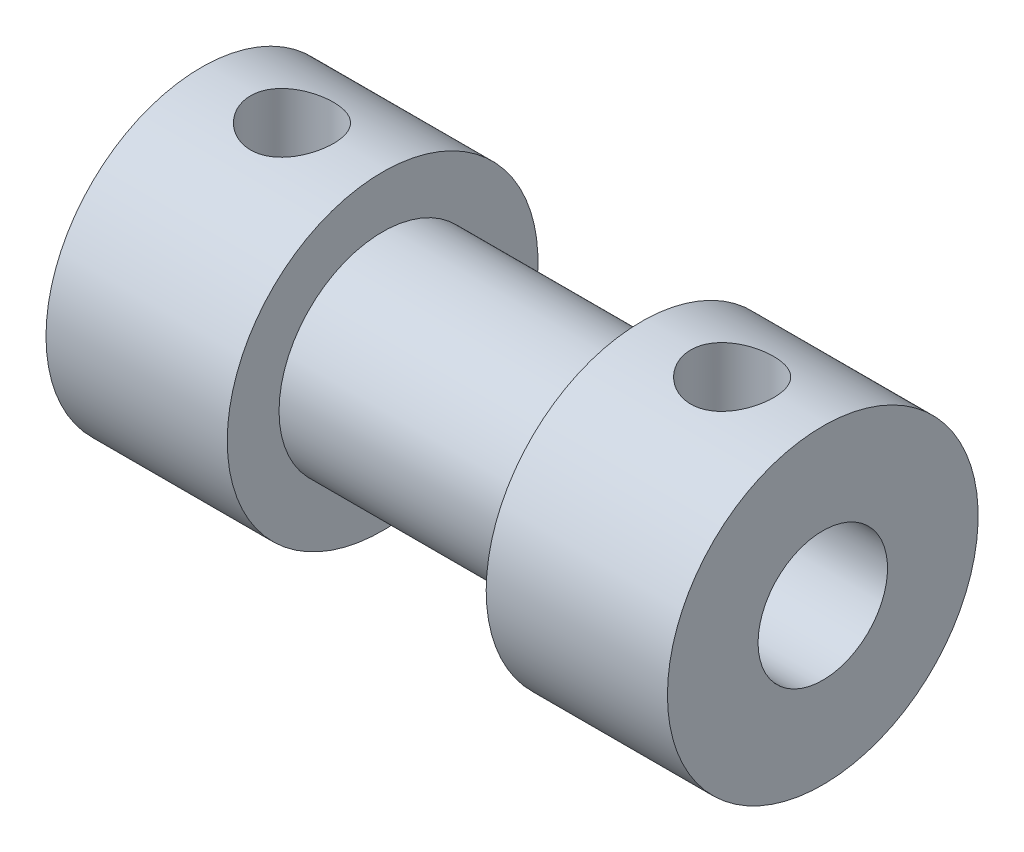
ISO-10303-21;
HEADER;
FILE_DESCRIPTION(('STEP AP214'),'2;1');
FILE_NAME('part.step','',(''),(''),'','','');
FILE_SCHEMA(('AUTOMOTIVE_DESIGN { 1 0 10303 214 1 1 1 1 }'));
ENDSEC;
DATA;
#1=APPLICATION_CONTEXT('core data for automotive mechanical design processes');
#2=APPLICATION_PROTOCOL_DEFINITION('international standard','automotive_design',2000,#1);
#3=PRODUCT_CONTEXT('',#1,'mechanical');
#4=PRODUCT('Part','Part','',(#3));
#5=PRODUCT_RELATED_PRODUCT_CATEGORY('part','',(#4));
#6=PRODUCT_DEFINITION_FORMATION('','',#4);
#7=PRODUCT_DEFINITION_CONTEXT('part definition',#1,'design');
#8=PRODUCT_DEFINITION('design','',#6,#7);
#9=PRODUCT_DEFINITION_SHAPE('','',#8);
#10=(LENGTH_UNIT() NAMED_UNIT(*) SI_UNIT(.MILLI.,.METRE.));
#11=(NAMED_UNIT(*) PLANE_ANGLE_UNIT() SI_UNIT($,.RADIAN.));
#12=(NAMED_UNIT(*) SI_UNIT($,.STERADIAN.) SOLID_ANGLE_UNIT());
#13=UNCERTAINTY_MEASURE_WITH_UNIT(LENGTH_MEASURE(1.E-05),#10,'distance_accuracy_value','');
#14=(GEOMETRIC_REPRESENTATION_CONTEXT(3) GLOBAL_UNCERTAINTY_ASSIGNED_CONTEXT((#13)) GLOBAL_UNIT_ASSIGNED_CONTEXT((#10,
#11,#12)) REPRESENTATION_CONTEXT('',''));
#15=CARTESIAN_POINT('',(0.,0.,0.));
#16=DIRECTION('',(0.,0.,1.));
#17=DIRECTION('',(1.,0.,0.));
#18=AXIS2_PLACEMENT_3D('',#15,#16,#17);
#19=CARTESIAN_POINT('',(0.,0.,0.));
#20=DIRECTION('',(-1.,0.,0.));
#21=DIRECTION('',(0.,0.,1.));
#22=AXIS2_PLACEMENT_3D('',#19,#20,#21);
#23=CYLINDRICAL_SURFACE('',#22,6.00000000000001);
#24=CARTESIAN_POINT('',(0.,0.,0.));
#25=DIRECTION('',(-1.,0.,0.));
#26=DIRECTION('',(0.,0.,1.));
#27=AXIS2_PLACEMENT_3D('',#24,#25,#26);
#28=CIRCLE('',#27,6.00000000000001);
#29=CARTESIAN_POINT('',(0.,0.,6.00000000000001));
#30=VERTEX_POINT('',#29);
#31=EDGE_CURVE('E117',#30,#30,#28,.T.);
#32=ORIENTED_EDGE('',*,*,#31,.F.);
#33=EDGE_LOOP('',(#32));
#34=FACE_BOUND('',#33,.T.);
#35=CARTESIAN_POINT('',(7.,0.,0.));
#36=DIRECTION('',(-1.,0.,0.));
#37=DIRECTION('',(0.,0.,1.));
#38=AXIS2_PLACEMENT_3D('',#35,#36,#37);
#39=CIRCLE('',#38,6.00000000000001);
#40=CARTESIAN_POINT('',(7.,0.,6.00000000000001));
#41=VERTEX_POINT('',#40);
#42=EDGE_CURVE('E10',#41,#41,#39,.T.);
#43=ORIENTED_EDGE('',*,*,#42,.T.);
#44=EDGE_LOOP('',(#43));
#45=FACE_BOUND('',#44,.T.);
#46=CARTESIAN_POINT('',(3.5,5.78273291792039,-1.6));
#47=CARTESIAN_POINT('',(3.58814075019101,5.78273444556331,-1.59999787452613));
#48=CARTESIAN_POINT('',(3.67630400038049,5.78477011639345,-1.59269194579772));
#49=CARTESIAN_POINT('',(3.85008433724543,5.79266848924473,-1.56371666608212));
#50=CARTESIAN_POINT('',(3.93570012398253,5.79853311126454,-1.54204010896768));
#51=CARTESIAN_POINT('',(4.10184645595733,5.81337900141366,-1.48508676448053));
#52=CARTESIAN_POINT('',(4.18238396706272,5.82235588547336,-1.44982910033741));
#53=CARTESIAN_POINT('',(4.33641339204788,5.8424092393635,-1.36677427650965));
#54=CARTESIAN_POINT('',(4.4099047580056,5.85348587227547,-1.3189761427316));
#55=CARTESIAN_POINT('',(4.54959403759017,5.87680111642766,-1.21091878299647));
#56=CARTESIAN_POINT('',(4.61558961397157,5.88906032893153,-1.15040238003367));
#57=CARTESIAN_POINT('',(4.73662526156096,5.91318161149208,-1.01917941827217));
#58=CARTESIAN_POINT('',(4.79166419691344,5.92504364026753,-0.948471804277317));
#59=CARTESIAN_POINT('',(4.89006795072234,5.94726390774735,-0.797470536698617));
#60=CARTESIAN_POINT('',(4.93323161490629,5.95759501009835,-0.717041455903585));
#61=CARTESIAN_POINT('',(5.00534770829381,5.97535300969468,-0.549746435783273));
#62=CARTESIAN_POINT('',(5.03430253382525,5.9827803966101,-0.462881584700083));
#63=CARTESIAN_POINT('',(5.07652417618862,5.9937484286117,-0.287292769448072));
#64=CARTESIAN_POINT('',(5.09013518130073,5.99737421400213,-0.198656979360733));
#65=CARTESIAN_POINT('',(5.10236569608574,6.000628196942,-0.0202908428068604));
#66=CARTESIAN_POINT('',(5.10098771490411,6.00025706357287,0.0694393179508239));
#67=CARTESIAN_POINT('',(5.08352174996842,5.99562140687814,0.245051389689077));
#68=CARTESIAN_POINT('',(5.06780563389097,5.99145531221602,0.330973280576889));
#69=CARTESIAN_POINT('',(5.02271028977444,5.97981398872374,0.498913052456844));
#70=CARTESIAN_POINT('',(4.99333028265117,5.97233857120463,0.580930710544465));
#71=CARTESIAN_POINT('',(4.9214561219261,5.95477255279923,0.739683156118044));
#72=CARTESIAN_POINT('',(4.87883455431944,5.94465670302172,0.816357349063633));
#73=CARTESIAN_POINT('',(4.78178494439273,5.9228997480757,0.961591999011613));
#74=CARTESIAN_POINT('',(4.72735460077747,5.91125834578276,1.03015087046869));
#75=CARTESIAN_POINT('',(4.60625851365286,5.88729018351105,1.15942829557249));
#76=CARTESIAN_POINT('',(4.53926844396049,5.87495335495479,1.21984153614219));
#77=CARTESIAN_POINT('',(4.39598025900898,5.8513072401833,1.32865065683815));
#78=CARTESIAN_POINT('',(4.31968157663975,5.83999801664632,1.37704580423844));
#79=CARTESIAN_POINT('',(4.15927991854284,5.81964721826454,1.46067743349022));
#80=CARTESIAN_POINT('',(4.07513171926907,5.81062005680584,1.49583093280429));
#81=CARTESIAN_POINT('',(3.90181880043644,5.79603460063157,1.55139201348531));
#82=CARTESIAN_POINT('',(3.81265533084127,5.79047544571886,1.57180325169042));
#83=CARTESIAN_POINT('',(3.63469823118271,5.78363868515235,1.59677405674218));
#84=CARTESIAN_POINT('',(3.54597316111142,5.78223810662158,1.60178906096974));
#85=CARTESIAN_POINT('',(3.36895218175803,5.78354062803714,1.597079848984));
#86=CARTESIAN_POINT('',(3.28065622780623,5.78624329125357,1.58735720137773));
#87=CARTESIAN_POINT('',(3.10875472472192,5.79532899431387,1.55385017495931));
#88=CARTESIAN_POINT('',(3.02509164964892,5.80164031753083,1.53033958330325));
#89=CARTESIAN_POINT('',(2.86289629491335,5.81716215168586,1.47023189380392));
#90=CARTESIAN_POINT('',(2.78436468685841,5.82637304120573,1.43363308701324));
#91=CARTESIAN_POINT('',(2.63275603405147,5.8469085797663,1.34746324406962));
#92=CARTESIAN_POINT('',(2.55983681928811,5.8582752389782,1.29762476190339));
#93=CARTESIAN_POINT('',(2.42322935863757,5.88174273547406,1.18672182390013));
#94=CARTESIAN_POINT('',(2.35954285203671,5.8938437104832,1.12565525778373));
#95=CARTESIAN_POINT('',(2.24131802140004,5.91783971907434,0.991923026003871));
#96=CARTESIAN_POINT('',(2.18709729841713,5.92971869219045,0.918973132807078));
#97=CARTESIAN_POINT('',(2.09167121007159,5.95157336013738,0.764742748752596));
#98=CARTESIAN_POINT('',(2.05046515193686,5.96154915626334,0.683462701615108));
#99=CARTESIAN_POINT('',(1.98261629411079,5.97840920719401,0.515451307860697));
#100=CARTESIAN_POINT('',(1.95586478444522,5.98531646784309,0.428766282305868));
#101=CARTESIAN_POINT('',(1.91736901754851,5.99536243029799,0.251919507785058));
#102=CARTESIAN_POINT('',(1.90562143458025,5.99850196723977,0.1617585338562));
#103=CARTESIAN_POINT('',(1.89767534100686,6.00061930750161,-0.0165136010769244));
#104=CARTESIAN_POINT('',(1.90101094469509,5.99972181030495,-0.104602809222309));
#105=CARTESIAN_POINT('',(1.92205479486014,5.99414792783061,-0.278918643704556));
#106=CARTESIAN_POINT('',(1.93976250169353,5.98947168443723,-0.365145339850184));
#107=CARTESIAN_POINT('',(1.98878448393498,5.97689048312845,-0.532728098771436));
#108=CARTESIAN_POINT('',(2.02000423477833,5.96900797751776,-0.614113609481484));
#109=CARTESIAN_POINT('',(2.09507968139661,5.95083853212804,-0.770537678776833));
#110=CARTESIAN_POINT('',(2.13893714928884,5.94055125517941,-0.845575345328786));
#111=CARTESIAN_POINT('',(2.23940661771106,5.918330649808,-0.989342614939897));
#112=CARTESIAN_POINT('',(2.29632750456438,5.90636074702983,-1.05785068939028));
#113=CARTESIAN_POINT('',(2.42072219948647,5.8822720005613,-1.18450029724544));
#114=CARTESIAN_POINT('',(2.4881987806351,5.87015311850575,-1.24263909793084));
#115=CARTESIAN_POINT('',(2.63357471667252,5.84683167732793,-1.34816560187261));
#116=CARTESIAN_POINT('',(2.7116706509992,5.83565513061493,-1.39528875413901));
#117=CARTESIAN_POINT('',(2.87496504876251,5.81585115203584,-1.47566951228968));
#118=CARTESIAN_POINT('',(2.96015882285178,5.80722205399804,-1.50893618695116));
#119=CARTESIAN_POINT('',(3.12086506882721,5.79468800506477,-1.55630499401031));
#120=CARTESIAN_POINT('',(3.19568101164166,5.79024112213282,-1.57265214719335));
#121=CARTESIAN_POINT('',(3.34699244639889,5.78426308173731,-1.59449995435361));
#122=CARTESIAN_POINT('',(3.42348774583211,5.78273159182091,-1.60000184505801));
#123=CARTESIAN_POINT('',(3.5,5.78273291792039,-1.6));
#124=B_SPLINE_CURVE_WITH_KNOTS('',3,(#46,#47,#48,#49,#50,#51,#52,#53,#54,#55,#56,#57,#58,#59,
#60,#61,#62,#63,#64,#65,#66,#67,#68,#69,#70,#71,#72,#73,#74,#75,#76,#77,#78,#79,#80,#81,#82,#83,
#84,#85,#86,#87,#88,#89,#90,#91,#92,#93,#94,#95,#96,#97,#98,#99,#100,#101,#102,#103,#104,#105,
#106,#107,#108,#109,#110,#111,#112,#113,#114,#115,#116,#117,#118,#119,#120,#121,#122,#123),
.UNSPECIFIED.,.T.,.F.,(4,2,2,2,2,2,2,2,2,2,2,2,2,2,2,2,2,2,2,2,2,2,2,2,2,2,2,2,2,2,2,2,2,2,2,2,
2,2,4),(0.,0.26414090249282,0.528414358280161,0.792317049276935,1.05624024524884,
1.32612732904169,1.59604237699569,1.87028165896643,2.14447467443397,2.41238643453184,
2.68025334708483,2.94136456640643,3.20249067552557,3.46621159124456,3.72998394715593,
4.00185409840264,4.27374082111664,4.54730412077229,4.82079953934806,5.08612267391536,
5.35141757070659,5.61161480341916,5.87184602287715,6.13779707970074,6.40379817229036,
6.67748725563563,6.95116176802339,7.22274831668977,7.49427465563061,7.75747243929027,
8.02066034086226,8.28203611890789,8.54344856608627,8.81183083189118,9.08028372300695,
9.35464031183429,9.62881705674852,9.8581357413103,10.0874282742632),.UNSPECIFIED.);
#125=CARTESIAN_POINT('',(3.5,5.78273291792039,-1.6));
#126=VERTEX_POINT('',#125);
#127=EDGE_CURVE('E84',#126,#126,#124,.T.);
#128=ORIENTED_EDGE('',*,*,#127,.T.);
#129=EDGE_LOOP('',(#128));
#130=FACE_BOUND('',#129,.T.);
#131=ADVANCED_FACE('F37',(#34,#45,#130),#23,.T.);
#132=CARTESIAN_POINT('',(0.,0.,0.));
#133=DIRECTION('',(-1.,0.,0.));
#134=DIRECTION('',(0.,0.,1.));
#135=AXIS2_PLACEMENT_3D('',#132,#133,#134);
#136=CYLINDRICAL_SURFACE('',#135,6.00000000000001);
#137=CARTESIAN_POINT('',(17.,0.,0.));
#138=DIRECTION('',(-1.,0.,0.));
#139=DIRECTION('',(0.,0.,1.));
#140=AXIS2_PLACEMENT_3D('',#137,#138,#139);
#141=CIRCLE('',#140,6.00000000000001);
#142=CARTESIAN_POINT('',(17.,0.,6.00000000000001));
#143=VERTEX_POINT('',#142);
#144=EDGE_CURVE('E195',#143,#143,#141,.T.);
#145=ORIENTED_EDGE('',*,*,#144,.F.);
#146=EDGE_LOOP('',(#145));
#147=FACE_BOUND('',#146,.T.);
#148=CARTESIAN_POINT('',(24.,0.,0.));
#149=DIRECTION('',(-1.,0.,0.));
#150=DIRECTION('',(0.,0.,1.));
#151=AXIS2_PLACEMENT_3D('',#148,#149,#150);
#152=CIRCLE('',#151,6.00000000000001);
#153=CARTESIAN_POINT('',(24.,0.,6.00000000000001));
#154=VERTEX_POINT('',#153);
#155=EDGE_CURVE('E193',#154,#154,#152,.T.);
#156=ORIENTED_EDGE('',*,*,#155,.T.);
#157=EDGE_LOOP('',(#156));
#158=FACE_BOUND('',#157,.T.);
#159=CARTESIAN_POINT('',(20.5,5.78273291792039,-1.6));
#160=CARTESIAN_POINT('',(20.588140750191,5.78273444556331,-1.59999787452613));
#161=CARTESIAN_POINT('',(20.6763040003805,5.78477011639345,-1.59269194579772));
#162=CARTESIAN_POINT('',(20.8500843372454,5.79266848924473,-1.56371666608212));
#163=CARTESIAN_POINT('',(20.9357001239825,5.79853311126454,-1.54204010896768));
#164=CARTESIAN_POINT('',(21.1018464559573,5.81337900141366,-1.48508676448053));
#165=CARTESIAN_POINT('',(21.1823839670627,5.82235588547336,-1.44982910033741));
#166=CARTESIAN_POINT('',(21.3364133920479,5.8424092393635,-1.36677427650965));
#167=CARTESIAN_POINT('',(21.4099047580056,5.85348587227547,-1.3189761427316));
#168=CARTESIAN_POINT('',(21.5495940375902,5.87680111642766,-1.21091878299647));
#169=CARTESIAN_POINT('',(21.6155896139716,5.88906032893153,-1.15040238003367));
#170=CARTESIAN_POINT('',(21.736625261561,5.91318161149209,-1.01917941827217));
#171=CARTESIAN_POINT('',(21.7916641969134,5.92504364026753,-0.948471804277316));
#172=CARTESIAN_POINT('',(21.8900679507223,5.94726390774735,-0.797470536698616));
#173=CARTESIAN_POINT('',(21.9332316149063,5.95759501009835,-0.717041455903585));
#174=CARTESIAN_POINT('',(22.0053477082938,5.97535300969468,-0.549746435783274));
#175=CARTESIAN_POINT('',(22.0343025338252,5.9827803966101,-0.462881584700084));
#176=CARTESIAN_POINT('',(22.0765241761886,5.9937484286117,-0.287292769448074));
#177=CARTESIAN_POINT('',(22.0901351813007,5.99737421400213,-0.198656979360734));
#178=CARTESIAN_POINT('',(22.1023656960857,6.000628196942,-0.0202908428068615));
#179=CARTESIAN_POINT('',(22.1009877149041,6.00025706357287,0.0694393179508229));
#180=CARTESIAN_POINT('',(22.0835217499684,5.99562140687814,0.245051389689076));
#181=CARTESIAN_POINT('',(22.067805633891,5.99145531221602,0.330973280576887));
#182=CARTESIAN_POINT('',(22.0227102897744,5.97981398872375,0.498913052456843));
#183=CARTESIAN_POINT('',(21.9933302826512,5.97233857120463,0.580930710544463));
#184=CARTESIAN_POINT('',(21.9214561219261,5.95477255279923,0.739683156118043));
#185=CARTESIAN_POINT('',(21.8788345543194,5.94465670302172,0.816357349063632));
#186=CARTESIAN_POINT('',(21.7817849443927,5.9228997480757,0.961591999011612));
#187=CARTESIAN_POINT('',(21.7273546007775,5.91125834578276,1.03015087046869));
#188=CARTESIAN_POINT('',(21.6062585136529,5.88729018351105,1.15942829557249));
#189=CARTESIAN_POINT('',(21.5392684439605,5.87495335495479,1.21984153614219));
#190=CARTESIAN_POINT('',(21.395980259009,5.8513072401833,1.32865065683815));
#191=CARTESIAN_POINT('',(21.3196815766398,5.83999801664632,1.37704580423844));
#192=CARTESIAN_POINT('',(21.1592799185428,5.81964721826454,1.46067743349022));
#193=CARTESIAN_POINT('',(21.0751317192691,5.81062005680584,1.49583093280429));
#194=CARTESIAN_POINT('',(20.9018188004364,5.79603460063157,1.55139201348531));
#195=CARTESIAN_POINT('',(20.8126553308413,5.79047544571886,1.57180325169042));
#196=CARTESIAN_POINT('',(20.6346982311827,5.78363868515235,1.59677405674218));
#197=CARTESIAN_POINT('',(20.5459731611114,5.78223810662158,1.60178906096974));
#198=CARTESIAN_POINT('',(20.368952181758,5.78354062803714,1.597079848984));
#199=CARTESIAN_POINT('',(20.2806562278062,5.78624329125357,1.58735720137773));
#200=CARTESIAN_POINT('',(20.1087547247219,5.79532899431387,1.55385017495931));
#201=CARTESIAN_POINT('',(20.0250916496489,5.80164031753083,1.53033958330325));
#202=CARTESIAN_POINT('',(19.8628962949134,5.81716215168586,1.47023189380392));
#203=CARTESIAN_POINT('',(19.7843646868584,5.82637304120572,1.43363308701324));
#204=CARTESIAN_POINT('',(19.6327560340515,5.8469085797663,1.34746324406962));
#205=CARTESIAN_POINT('',(19.5598368192881,5.8582752389782,1.29762476190339));
#206=CARTESIAN_POINT('',(19.4232293586376,5.88174273547406,1.18672182390013));
#207=CARTESIAN_POINT('',(19.3595428520367,5.8938437104832,1.12565525778374));
#208=CARTESIAN_POINT('',(19.2413180214,5.91783971907434,0.991923026003872));
#209=CARTESIAN_POINT('',(19.1870972984171,5.92971869219045,0.918973132807078));
#210=CARTESIAN_POINT('',(19.0916712100716,5.95157336013738,0.764742748752596));
#211=CARTESIAN_POINT('',(19.0504651519369,5.96154915626333,0.683462701615107));
#212=CARTESIAN_POINT('',(18.9826162941108,5.97840920719401,0.515451307860697));
#213=CARTESIAN_POINT('',(18.9558647844452,5.98531646784309,0.428766282305869));
#214=CARTESIAN_POINT('',(18.9173690175485,5.99536243029799,0.251919507785059));
#215=CARTESIAN_POINT('',(18.9056214345802,5.99850196723977,0.161758533856202));
#216=CARTESIAN_POINT('',(18.8976753410069,6.00061930750161,-0.0165136010769222));
#217=CARTESIAN_POINT('',(18.9010109446951,5.99972181030495,-0.104602809222307));
#218=CARTESIAN_POINT('',(18.9220547948601,5.99414792783061,-0.278918643704554));
#219=CARTESIAN_POINT('',(18.9397625016935,5.98947168443723,-0.365145339850182));
#220=CARTESIAN_POINT('',(18.988784483935,5.97689048312845,-0.532728098771434));
#221=CARTESIAN_POINT('',(19.0200042347783,5.96900797751776,-0.614113609481481));
#222=CARTESIAN_POINT('',(19.0950796813966,5.95083853212804,-0.770537678776831));
#223=CARTESIAN_POINT('',(19.1389371492888,5.94055125517941,-0.845575345328784));
#224=CARTESIAN_POINT('',(19.2394066177111,5.918330649808,-0.989342614939896));
#225=CARTESIAN_POINT('',(19.2963275045644,5.90636074702983,-1.05785068939028));
#226=CARTESIAN_POINT('',(19.4207221994865,5.8822720005613,-1.18450029724544));
#227=CARTESIAN_POINT('',(19.4881987806351,5.87015311850575,-1.24263909793084));
#228=CARTESIAN_POINT('',(19.6335747166725,5.84683167732793,-1.34816560187261));
#229=CARTESIAN_POINT('',(19.7116706509992,5.83565513061492,-1.39528875413901));
#230=CARTESIAN_POINT('',(19.8749650487625,5.81585115203584,-1.47566951228968));
#231=CARTESIAN_POINT('',(19.9601588228518,5.80722205399804,-1.50893618695116));
#232=CARTESIAN_POINT('',(20.1208650688272,5.79468800506477,-1.55630499401031));
#233=CARTESIAN_POINT('',(20.1956810116417,5.79024112213282,-1.57265214719335));
#234=CARTESIAN_POINT('',(20.3469924463989,5.78426308173731,-1.59449995435361));
#235=CARTESIAN_POINT('',(20.4234877458321,5.78273159182091,-1.60000184505802));
#236=CARTESIAN_POINT('',(20.5,5.78273291792039,-1.6));
#237=B_SPLINE_CURVE_WITH_KNOTS('',3,(#159,#160,#161,#162,#163,#164,#165,#166,#167,#168,#169,
#170,#171,#172,#173,#174,#175,#176,#177,#178,#179,#180,#181,#182,#183,#184,#185,#186,#187,#188,
#189,#190,#191,#192,#193,#194,#195,#196,#197,#198,#199,#200,#201,#202,#203,#204,#205,#206,#207,
#208,#209,#210,#211,#212,#213,#214,#215,#216,#217,#218,#219,#220,#221,#222,#223,#224,#225,#226,
#227,#228,#229,#230,#231,#232,#233,#234,#235,#236),.UNSPECIFIED.,.T.,.F.,(4,2,2,2,2,2,2,2,2,2,2,
2,2,2,2,2,2,2,2,2,2,2,2,2,2,2,2,2,2,2,2,2,2,2,2,2,2,2,4),(0.,0.26414090249282,0.528414358280161,
0.792317049276933,1.05624024524884,1.32612732904169,1.59604237699569,1.87028165896643,
2.14447467443397,2.41238643453184,2.68025334708482,2.94136456640643,3.20249067552557,
3.46621159124456,3.72998394715593,4.00185409840264,4.27374082111664,4.54730412077229,
4.82079953934806,5.08612267391536,5.35141757070659,5.61161480341916,5.87184602287715,
6.13779707970074,6.40379817229036,6.67748725563563,6.95116176802339,7.22274831668977,
7.49427465563061,7.75747243929027,8.02066034086226,8.28203611890788,8.54344856608627,
8.81183083189118,9.08028372300695,9.35464031183428,9.62881705674851,9.8581357413103,
10.0874282742632),.UNSPECIFIED.);
#238=CARTESIAN_POINT('',(20.5,5.78273291792039,-1.6));
#239=VERTEX_POINT('',#238);
#240=EDGE_CURVE('E64',#239,#239,#237,.T.);
#241=ORIENTED_EDGE('',*,*,#240,.T.);
#242=EDGE_LOOP('',(#241));
#243=FACE_BOUND('',#242,.T.);
#244=ADVANCED_FACE('F89',(#147,#158,#243),#136,.T.);
#245=CARTESIAN_POINT('',(0.,0.,0.));
#246=DIRECTION('',(-1.,0.,0.));
#247=DIRECTION('',(0.,0.,1.));
#248=AXIS2_PLACEMENT_3D('',#245,#246,#247);
#249=CYLINDRICAL_SURFACE('',#248,2.5);
#250=CARTESIAN_POINT('',(20.5,1.92093727122985,-1.6));
#251=CARTESIAN_POINT('',(20.4209481678449,1.92094929675224,-1.59999266980268));
#252=CARTESIAN_POINT('',(20.341830974611,1.92590694183847,-1.59409071194702));
#253=CARTESIAN_POINT('',(20.1863428380539,1.94483197493582,-1.5709338003336));
#254=CARTESIAN_POINT('',(20.1099774969851,1.95881675475542,-1.55365693021911));
#255=CARTESIAN_POINT('',(19.9626817917808,1.99339283913067,-1.50902809213764));
#256=CARTESIAN_POINT('',(19.891709887947,2.0139255491966,-1.48176517490528));
#257=CARTESIAN_POINT('',(19.7554372751118,2.05918269813725,-1.41819848083726));
#258=CARTESIAN_POINT('',(19.6901377611802,2.08390801709524,-1.38189280505693));
#259=CARTESIAN_POINT('',(19.5569235402749,2.13897354142922,-1.29529158278966));
#260=CARTESIAN_POINT('',(19.489946801967,2.16961314656237,-1.24374325625417));
#261=CARTESIAN_POINT('',(19.3647908408049,2.23063123265101,-1.13067234056544));
#262=CARTESIAN_POINT('',(19.306619384072,2.26100946106354,-1.06914104453314));
#263=CARTESIAN_POINT('',(19.1932853972278,2.32270549388218,-0.928267755260854));
#264=CARTESIAN_POINT('',(19.1394758177244,2.35364021667964,-0.847652473797736));
#265=CARTESIAN_POINT('',(19.0466273231249,2.40850378912356,-0.676153460195578));
#266=CARTESIAN_POINT('',(19.0075731932396,2.43243984950974,-0.585280431435417));
#267=CARTESIAN_POINT('',(18.9497997435695,2.46833278649757,-0.405946447572369));
#268=CARTESIAN_POINT('',(18.929370638099,2.48128656308655,-0.318241274591638));
#269=CARTESIAN_POINT('',(18.9035811117804,2.49768869635226,-0.139803958315014));
#270=CARTESIAN_POINT('',(18.8982037766548,2.50114772257577,-0.0490753287576827));
#271=CARTESIAN_POINT('',(18.9025366858399,2.498378182623,0.1190356970272));
#272=CARTESIAN_POINT('',(18.9102330573433,2.49344258097879,0.196502038259946));
#273=CARTESIAN_POINT('',(18.9365673464552,2.47673525221161,0.348779821361575));
#274=CARTESIAN_POINT('',(18.955206084742,2.46496301234114,0.423591063651564));
#275=CARTESIAN_POINT('',(19.0025425467877,2.43557709972901,0.568732783288925));
#276=CARTESIAN_POINT('',(19.0312441660046,2.41796116496761,0.639061512925822));
#277=CARTESIAN_POINT('',(19.0976186452607,2.37822781768238,0.773939281823774));
#278=CARTESIAN_POINT('',(19.1352933897005,2.35610945976937,0.838487103142219));
#279=CARTESIAN_POINT('',(19.2238988549614,2.30584779502719,0.968782579527988));
#280=CARTESIAN_POINT('',(19.2759060052492,2.27729600350201,1.03363914040694));
#281=CARTESIAN_POINT('',(19.3889196667313,2.21859535972812,1.1542733094548));
#282=CARTESIAN_POINT('',(19.4499396590404,2.18844415919704,1.21003704934261));
#283=CARTESIAN_POINT('',(19.5892084116873,2.12489219812468,1.31883510781613));
#284=CARTESIAN_POINT('',(19.6686731211468,2.09162488112658,1.37040347007831));
#285=CARTESIAN_POINT('',(19.8370992273644,2.03059734924002,1.45931097640837));
#286=CARTESIAN_POINT('',(19.9260430697867,2.00282721768733,1.49667585709193));
#287=CARTESIAN_POINT('',(20.0864087271189,1.96386522127246,1.54724382428149));
#288=CARTESIAN_POINT('',(20.1560296928441,1.9502192669071,1.56425281845881));
#289=CARTESIAN_POINT('',(20.2979070741101,1.93026845795846,1.58881156273389));
#290=CARTESIAN_POINT('',(20.3701593814495,1.92395262658793,1.59637545806751));
#291=CARTESIAN_POINT('',(20.5154938570159,1.91962320366883,1.60158089802513));
#292=CARTESIAN_POINT('',(20.5885778403822,1.92163407258447,1.59919320880048));
#293=CARTESIAN_POINT('',(20.7331045470984,1.93368427137994,1.58459705676922));
#294=CARTESIAN_POINT('',(20.8045458453003,1.94373032064197,1.57238037446235));
#295=CARTESIAN_POINT('',(20.9420248056606,1.97001025135346,1.53931298656201));
#296=CARTESIAN_POINT('',(21.0081564698988,1.986068929342,1.51870542186382));
#297=CARTESIAN_POINT('',(21.1361411938671,2.02259882290731,1.46970265955526));
#298=CARTESIAN_POINT('',(21.1979928246362,2.04307150287309,1.44130487660896));
#299=CARTESIAN_POINT('',(21.3284878642615,2.09093679483715,1.3711727724603));
#300=CARTESIAN_POINT('',(21.3961037071548,2.11890031658289,1.32791764489245));
#301=CARTESIAN_POINT('',(21.5238875328694,2.17602300938462,1.23208892842886));
#302=CARTESIAN_POINT('',(21.5840465097809,2.20518357066768,1.17950425464882));
#303=CARTESIAN_POINT('',(21.7062908880441,2.26757496710245,1.05534739908252));
#304=CARTESIAN_POINT('',(21.7667645034199,2.30059058781224,0.982061194060879));
#305=CARTESIAN_POINT('',(21.8744982953549,2.36162660589386,0.824518692093041));
#306=CARTESIAN_POINT('',(21.92177294194,2.38965246122978,0.740274558086506));
#307=CARTESIAN_POINT('',(21.9930135802566,2.43278860861862,0.580481441514729));
#308=CARTESIAN_POINT('',(22.0197501499749,2.44936091431536,0.506562244626874));
#309=CARTESIAN_POINT('',(22.0622232382895,2.47593704327769,0.354506889516453));
#310=CARTESIAN_POINT('',(22.0779685955759,2.48594614401444,0.276374174235063));
#311=CARTESIAN_POINT('',(22.0976658853935,2.4984950835468,0.117765010626164));
#312=CARTESIAN_POINT('',(22.1015791869695,2.50101045537361,0.0372817494625115));
#313=CARTESIAN_POINT('',(22.0972664080699,2.49825080414527,-0.123228587959573));
#314=CARTESIAN_POINT('',(22.0890394279495,2.49297520374694,-0.203255629969114));
#315=CARTESIAN_POINT('',(22.0616625534951,2.47561839661759,-0.35629168704281));
#316=CARTESIAN_POINT('',(22.0430988102772,2.46390279532997,-0.429449689513363));
#317=CARTESIAN_POINT('',(21.9963492139771,2.43489749580169,-0.571427780233763));
#318=CARTESIAN_POINT('',(21.9681618045686,2.417606896005,-0.640247164714339));
#319=CARTESIAN_POINT('',(21.9007153874218,2.37722910160736,-0.777347683050109));
#320=CARTESIAN_POINT('',(21.8607796962677,2.35380214583302,-0.84519355582254));
#321=CARTESIAN_POINT('',(21.772119686068,2.3036820632704,-0.973553500702695));
#322=CARTESIAN_POINT('',(21.723388428061,2.27698636310446,-1.03406172055244));
#323=CARTESIAN_POINT('',(21.6100446996927,2.21799531667021,-1.15573970153829));
#324=CARTESIAN_POINT('',(21.5441433919508,2.1854675223777,-1.21559857001107));
#325=CARTESIAN_POINT('',(21.4029310762217,2.1216311513725,-1.32387007814959));
#326=CARTESIAN_POINT('',(21.3276171246583,2.09032296009627,-1.37227912340201));
#327=CARTESIAN_POINT('',(21.1796446872829,2.03662860600275,-1.45054229366139));
#328=CARTESIAN_POINT('',(21.108092768691,2.01360698178615,-1.48204588037107));
#329=CARTESIAN_POINT('',(20.9596586568857,1.97388507219661,-1.53455934001008));
#330=CARTESIAN_POINT('',(20.8827908630239,1.95716844504627,-1.55559638677458));
#331=CARTESIAN_POINT('',(20.7544414857279,1.93709113754663,-1.58045176282882));
#332=CARTESIAN_POINT('',(20.7040306607202,1.93107919552915,-1.58775783357985));
#333=CARTESIAN_POINT('',(20.6024223850075,1.9229983172766,-1.59753438705835));
#334=CARTESIAN_POINT('',(20.5512249148327,1.92092947879363,-1.60000474990552));
#335=CARTESIAN_POINT('',(20.5,1.92093727122985,-1.6));
#336=B_SPLINE_CURVE_WITH_KNOTS('',3,(#250,#251,#252,#253,#254,#255,#256,#257,#258,#259,#260,
#261,#262,#263,#264,#265,#266,#267,#268,#269,#270,#271,#272,#273,#274,#275,#276,#277,#278,#279,
#280,#281,#282,#283,#284,#285,#286,#287,#288,#289,#290,#291,#292,#293,#294,#295,#296,#297,#298,
#299,#300,#301,#302,#303,#304,#305,#306,#307,#308,#309,#310,#311,#312,#313,#314,#315,#316,#317,
#318,#319,#320,#321,#322,#323,#324,#325,#326,#327,#328,#329,#330,#331,#332,#333,#334,#335),
.UNSPECIFIED.,.T.,.F.,(4,2,2,2,2,2,2,2,2,2,2,2,2,2,2,2,2,2,2,2,2,2,2,2,2,2,2,2,2,2,2,2,2,2,2,2,
2,2,2,2,2,2,4),(0.,0.236924124689134,0.474306078762228,0.709620757721981,0.944984893587536,
1.21366158828906,1.48257388793403,1.78612760550099,2.08936745985237,2.36063693064251,
2.63160144244018,2.86449109266467,3.09739821185699,3.33039559182981,3.56344194561728,
3.82612168285744,4.08919838322311,4.38897465346901,4.6882051119949,4.90617672102731,
5.12382149682872,5.34210607748189,5.56057338868967,5.77311584568292,5.98572892454862,
6.23980222154462,6.49417944196642,6.79446546601537,7.09442098222545,7.33439678655726,
7.57417938901363,7.81474402652677,8.05532649176612,8.28348215136488,8.51167472547854,
8.7571445325871,9.0028088479535,9.28600019678806,9.56928032950168,9.81286777208525,
10.0558194550334,10.209340466752,10.3628652843072),.UNSPECIFIED.);
#337=CARTESIAN_POINT('',(20.5,1.92093727122985,-1.6));
#338=VERTEX_POINT('',#337);
#339=EDGE_CURVE('E58',#338,#338,#336,.T.);
#340=ORIENTED_EDGE('',*,*,#339,.T.);
#341=EDGE_LOOP('',(#340));
#342=FACE_BOUND('',#341,.T.);
#343=CARTESIAN_POINT('',(0.,0.,0.));
#344=DIRECTION('',(-1.,0.,0.));
#345=DIRECTION('',(0.,0.,1.));
#346=AXIS2_PLACEMENT_3D('',#343,#344,#345);
#347=CIRCLE('',#346,2.5);
#348=CARTESIAN_POINT('',(0.,0.,2.5));
#349=VERTEX_POINT('',#348);
#350=EDGE_CURVE('E122',#349,#349,#347,.T.);
#351=ORIENTED_EDGE('',*,*,#350,.T.);
#352=EDGE_LOOP('',(#351));
#353=FACE_BOUND('',#352,.T.);
#354=CARTESIAN_POINT('',(24.,0.,0.));
#355=DIRECTION('',(-1.,0.,0.));
#356=DIRECTION('',(0.,0.,1.));
#357=AXIS2_PLACEMENT_3D('',#354,#355,#356);
#358=CIRCLE('',#357,2.5);
#359=CARTESIAN_POINT('',(24.,0.,2.5));
#360=VERTEX_POINT('',#359);
#361=EDGE_CURVE('E190',#360,#360,#358,.T.);
#362=ORIENTED_EDGE('',*,*,#361,.F.);
#363=EDGE_LOOP('',(#362));
#364=FACE_BOUND('',#363,.T.);
#365=CARTESIAN_POINT('',(3.5,1.92093727122985,-1.6));
#366=CARTESIAN_POINT('',(3.42094816784489,1.92094929675224,-1.59999266980268));
#367=CARTESIAN_POINT('',(3.34183097461098,1.92590694183847,-1.59409071194702));
#368=CARTESIAN_POINT('',(3.18634283805392,1.94483197493582,-1.5709338003336));
#369=CARTESIAN_POINT('',(3.10997749698514,1.95881675475542,-1.55365693021911));
#370=CARTESIAN_POINT('',(2.96268179178083,1.99339283913067,-1.50902809213764));
#371=CARTESIAN_POINT('',(2.89170988794703,2.0139255491966,-1.48176517490528));
#372=CARTESIAN_POINT('',(2.75543727511183,2.05918269813725,-1.41819848083726));
#373=CARTESIAN_POINT('',(2.69013776118024,2.08390801709524,-1.38189280505693));
#374=CARTESIAN_POINT('',(2.55692354027495,2.13897354142923,-1.29529158278966));
#375=CARTESIAN_POINT('',(2.48994680196703,2.16961314656237,-1.24374325625417));
#376=CARTESIAN_POINT('',(2.36479084080492,2.23063123265102,-1.13067234056544));
#377=CARTESIAN_POINT('',(2.306619384072,2.26100946106354,-1.06914104453314));
#378=CARTESIAN_POINT('',(2.19328539722775,2.32270549388218,-0.928267755260851));
#379=CARTESIAN_POINT('',(2.13947581772437,2.35364021667964,-0.847652473797733));
#380=CARTESIAN_POINT('',(2.04662732312485,2.40850378912356,-0.676153460195575));
#381=CARTESIAN_POINT('',(2.00757319323962,2.43243984950974,-0.585280431435414));
#382=CARTESIAN_POINT('',(1.94979974356947,2.46833278649757,-0.405946447572367));
#383=CARTESIAN_POINT('',(1.92937063809898,2.48128656308655,-0.318241274591635));
#384=CARTESIAN_POINT('',(1.90358111178042,2.49768869635226,-0.139803958315011));
#385=CARTESIAN_POINT('',(1.8982037766548,2.50114772257577,-0.0490753287576808));
#386=CARTESIAN_POINT('',(1.90253668583994,2.498378182623,0.119035697027201));
#387=CARTESIAN_POINT('',(1.91023305734327,2.49344258097879,0.196502038259947));
#388=CARTESIAN_POINT('',(1.93656734645523,2.47673525221161,0.348779821361576));
#389=CARTESIAN_POINT('',(1.95520608474196,2.46496301234114,0.423591063651565));
#390=CARTESIAN_POINT('',(2.00254254678765,2.43557709972901,0.568732783288925));
#391=CARTESIAN_POINT('',(2.03124416600463,2.41796116496761,0.639061512925823));
#392=CARTESIAN_POINT('',(2.0976186452607,2.37822781768238,0.773939281823775));
#393=CARTESIAN_POINT('',(2.13529338970054,2.35610945976937,0.83848710314222));
#394=CARTESIAN_POINT('',(2.22389885496144,2.30584779502719,0.968782579527989));
#395=CARTESIAN_POINT('',(2.27590600524919,2.27729600350201,1.03363914040694));
#396=CARTESIAN_POINT('',(2.38891966673125,2.21859535972812,1.15427330945481));
#397=CARTESIAN_POINT('',(2.44993965904043,2.18844415919704,1.21003704934261));
#398=CARTESIAN_POINT('',(2.58920841168727,2.12489219812468,1.31883510781613));
#399=CARTESIAN_POINT('',(2.66867312114676,2.09162488112658,1.37040347007831));
#400=CARTESIAN_POINT('',(2.83709922736442,2.03059734924002,1.45931097640837));
#401=CARTESIAN_POINT('',(2.9260430697867,2.00282721768733,1.49667585709193));
#402=CARTESIAN_POINT('',(3.08640872711894,1.96386522127246,1.54724382428149));
#403=CARTESIAN_POINT('',(3.15602969284413,1.9502192669071,1.56425281845881));
#404=CARTESIAN_POINT('',(3.29790707411012,1.93026845795846,1.58881156273389));
#405=CARTESIAN_POINT('',(3.37015938144947,1.92395262658793,1.59637545806751));
#406=CARTESIAN_POINT('',(3.51549385701591,1.91962320366883,1.60158089802513));
#407=CARTESIAN_POINT('',(3.58857784038223,1.92163407258447,1.59919320880048));
#408=CARTESIAN_POINT('',(3.7331045470984,1.93368427137994,1.58459705676922));
#409=CARTESIAN_POINT('',(3.80454584530027,1.94373032064197,1.57238037446235));
#410=CARTESIAN_POINT('',(3.94202480566056,1.97001025135346,1.53931298656201));
#411=CARTESIAN_POINT('',(4.00815646989882,1.98606892934201,1.51870542186382));
#412=CARTESIAN_POINT('',(4.13614119386714,2.02259882290732,1.46970265955526));
#413=CARTESIAN_POINT('',(4.19799282463618,2.04307150287309,1.44130487660896));
#414=CARTESIAN_POINT('',(4.32848786426146,2.09093679483715,1.3711727724603));
#415=CARTESIAN_POINT('',(4.39610370715484,2.11890031658289,1.32791764489245));
#416=CARTESIAN_POINT('',(4.52388753286944,2.17602300938462,1.23208892842886));
#417=CARTESIAN_POINT('',(4.5840465097809,2.20518357066768,1.17950425464882));
#418=CARTESIAN_POINT('',(4.70629088804414,2.26757496710245,1.05534739908252));
#419=CARTESIAN_POINT('',(4.76676450341995,2.30059058781224,0.982061194060875));
#420=CARTESIAN_POINT('',(4.87449829535493,2.36162660589386,0.824518692093035));
#421=CARTESIAN_POINT('',(4.92177294193999,2.38965246122978,0.7402745580865));
#422=CARTESIAN_POINT('',(4.99301358025664,2.43278860861862,0.580481441514722));
#423=CARTESIAN_POINT('',(5.01975014997495,2.44936091431536,0.506562244626867));
#424=CARTESIAN_POINT('',(5.06222323828951,2.47593704327769,0.354506889516445));
#425=CARTESIAN_POINT('',(5.07796859557589,2.48594614401444,0.276374174235054));
#426=CARTESIAN_POINT('',(5.09766588539354,2.4984950835468,0.117765010626156));
#427=CARTESIAN_POINT('',(5.10157918696949,2.50101045537361,0.0372817494625033));
#428=CARTESIAN_POINT('',(5.09726640806992,2.49825080414527,-0.123228587959581));
#429=CARTESIAN_POINT('',(5.08903942794951,2.49297520374694,-0.203255629969122));
#430=CARTESIAN_POINT('',(5.06166255349509,2.47561839661759,-0.356291687042818));
#431=CARTESIAN_POINT('',(5.04309881027718,2.46390279532997,-0.429449689513371));
#432=CARTESIAN_POINT('',(4.99634921397708,2.43489749580169,-0.571427780233771));
#433=CARTESIAN_POINT('',(4.96816180456862,2.417606896005,-0.640247164714346));
#434=CARTESIAN_POINT('',(4.90071538742183,2.37722910160736,-0.777347683050117));
#435=CARTESIAN_POINT('',(4.86077969626768,2.35380214583302,-0.845193555822547));
#436=CARTESIAN_POINT('',(4.772119686068,2.30368206327039,-0.973553500702702));
#437=CARTESIAN_POINT('',(4.72338842806095,2.27698636310446,-1.03406172055245));
#438=CARTESIAN_POINT('',(4.61004469969267,2.21799531667021,-1.15573970153829));
#439=CARTESIAN_POINT('',(4.54414339195078,2.1854675223777,-1.21559857001108));
#440=CARTESIAN_POINT('',(4.40293107622171,2.1216311513725,-1.3238700781496));
#441=CARTESIAN_POINT('',(4.32761712465825,2.09032296009626,-1.37227912340201));
#442=CARTESIAN_POINT('',(4.17964468728286,2.03662860600275,-1.4505422936614));
#443=CARTESIAN_POINT('',(4.10809276869098,2.01360698178615,-1.48204588037107));
#444=CARTESIAN_POINT('',(3.95965865688573,1.9738850721966,-1.53455934001009));
#445=CARTESIAN_POINT('',(3.88279086302388,1.95716844504627,-1.55559638677458));
#446=CARTESIAN_POINT('',(3.75444148572786,1.93709113754663,-1.58045176282882));
#447=CARTESIAN_POINT('',(3.7040306607202,1.93107919552915,-1.58775783357985));
#448=CARTESIAN_POINT('',(3.60242238500749,1.9229983172766,-1.59753438705835));
#449=CARTESIAN_POINT('',(3.55122491483271,1.92092947879363,-1.60000474990552));
#450=CARTESIAN_POINT('',(3.5,1.92093727122985,-1.6));
#451=B_SPLINE_CURVE_WITH_KNOTS('',3,(#365,#366,#367,#368,#369,#370,#371,#372,#373,#374,#375,
#376,#377,#378,#379,#380,#381,#382,#383,#384,#385,#386,#387,#388,#389,#390,#391,#392,#393,#394,
#395,#396,#397,#398,#399,#400,#401,#402,#403,#404,#405,#406,#407,#408,#409,#410,#411,#412,#413,
#414,#415,#416,#417,#418,#419,#420,#421,#422,#423,#424,#425,#426,#427,#428,#429,#430,#431,#432,
#433,#434,#435,#436,#437,#438,#439,#440,#441,#442,#443,#444,#445,#446,#447,#448,#449,#450),
.UNSPECIFIED.,.T.,.F.,(4,2,2,2,2,2,2,2,2,2,2,2,2,2,2,2,2,2,2,2,2,2,2,2,2,2,2,2,2,2,2,2,2,2,2,2,
2,2,2,2,2,2,4),(0.,0.236924124689131,0.474306078762229,0.709620757721981,0.944984893587538,
1.21366158828906,1.48257388793404,1.78612760550099,2.08936745985237,2.36063693064251,
2.63160144244018,2.86449109266467,3.09739821185699,3.33039559182981,3.56344194561728,
3.82612168285745,4.08919838322311,4.38897465346901,4.6882051119949,4.90617672102731,
5.12382149682872,5.34210607748189,5.56057338868968,5.77311584568293,5.98572892454863,
6.23980222154462,6.49417944196642,6.79446546601538,7.09442098222546,7.33439678655727,
7.57417938901364,7.81474402652678,8.05532649176613,8.28348215136489,8.51167472547855,
8.75714453258711,9.00280884795352,9.28600019678807,9.56928032950169,9.81286777208527,
10.0558194550334,10.209340466752,10.3628652843072),.UNSPECIFIED.);
#452=CARTESIAN_POINT('',(3.5,1.92093727122985,-1.6));
#453=VERTEX_POINT('',#452);
#454=EDGE_CURVE('E41',#453,#453,#451,.T.);
#455=ORIENTED_EDGE('',*,*,#454,.T.);
#456=EDGE_LOOP('',(#455));
#457=FACE_BOUND('',#456,.T.);
#458=ADVANCED_FACE('F65',(#342,#353,#364,#457),#249,.F.);
#459=CARTESIAN_POINT('',(7.,-6.00000000000001,0.));
#460=DIRECTION('',(1.,0.,0.));
#461=DIRECTION('',(0.,0.,-1.));
#462=AXIS2_PLACEMENT_3D('',#459,#460,#461);
#463=PLANE('',#462);
#464=CARTESIAN_POINT('',(7.,0.,0.));
#465=DIRECTION('',(-1.,0.,0.));
#466=DIRECTION('',(0.,0.,1.));
#467=AXIS2_PLACEMENT_3D('',#464,#465,#466);
#468=CIRCLE('',#467,4.00000000000001);
#469=CARTESIAN_POINT('',(7.,0.,4.00000000000001));
#470=VERTEX_POINT('',#469);
#471=EDGE_CURVE('E50',#470,#470,#468,.T.);
#472=ORIENTED_EDGE('',*,*,#471,.T.);
#473=EDGE_LOOP('',(#472));
#474=FACE_BOUND('',#473,.T.);
#475=ORIENTED_EDGE('',*,*,#42,.F.);
#476=EDGE_LOOP('',(#475));
#477=FACE_BOUND('',#476,.T.);
#478=ADVANCED_FACE('F101',(#474,#477),#463,.T.);
#479=CARTESIAN_POINT('',(0.,0.,0.));
#480=DIRECTION('',(-1.,0.,0.));
#481=DIRECTION('',(0.,0.,1.));
#482=AXIS2_PLACEMENT_3D('',#479,#480,#481);
#483=CYLINDRICAL_SURFACE('',#482,4.00000000000001);
#484=CARTESIAN_POINT('',(17.,0.,0.));
#485=DIRECTION('',(-1.,0.,0.));
#486=DIRECTION('',(0.,0.,1.));
#487=AXIS2_PLACEMENT_3D('',#484,#485,#486);
#488=CIRCLE('',#487,4.00000000000001);
#489=CARTESIAN_POINT('',(17.,0.,4.00000000000001));
#490=VERTEX_POINT('',#489);
#491=EDGE_CURVE('E55',#490,#490,#488,.T.);
#492=ORIENTED_EDGE('',*,*,#491,.T.);
#493=EDGE_LOOP('',(#492));
#494=FACE_BOUND('',#493,.T.);
#495=ORIENTED_EDGE('',*,*,#471,.F.);
#496=EDGE_LOOP('',(#495));
#497=FACE_BOUND('',#496,.T.);
#498=ADVANCED_FACE('F98',(#494,#497),#483,.T.);
#499=CARTESIAN_POINT('',(17.,-4.00000000000001,0.));
#500=DIRECTION('',(-1.,0.,0.));
#501=DIRECTION('',(0.,0.,1.));
#502=AXIS2_PLACEMENT_3D('',#499,#500,#501);
#503=PLANE('',#502);
#504=ORIENTED_EDGE('',*,*,#144,.T.);
#505=EDGE_LOOP('',(#504));
#506=FACE_BOUND('',#505,.T.);
#507=ORIENTED_EDGE('',*,*,#491,.F.);
#508=EDGE_LOOP('',(#507));
#509=FACE_BOUND('',#508,.T.);
#510=ADVANCED_FACE('F95',(#506,#509),#503,.T.);
#511=CARTESIAN_POINT('',(24.,-6.00000000000001,0.));
#512=DIRECTION('',(1.,0.,0.));
#513=DIRECTION('',(0.,0.,-1.));
#514=AXIS2_PLACEMENT_3D('',#511,#512,#513);
#515=PLANE('',#514);
#516=ORIENTED_EDGE('',*,*,#361,.T.);
#517=EDGE_LOOP('',(#516));
#518=FACE_BOUND('',#517,.T.);
#519=ORIENTED_EDGE('',*,*,#155,.F.);
#520=EDGE_LOOP('',(#519));
#521=FACE_BOUND('',#520,.T.);
#522=ADVANCED_FACE('F94',(#518,#521),#515,.T.);
#523=CARTESIAN_POINT('',(0.,-2.5,0.));
#524=DIRECTION('',(-1.,0.,0.));
#525=DIRECTION('',(0.,0.,1.));
#526=AXIS2_PLACEMENT_3D('',#523,#524,#525);
#527=PLANE('',#526);
#528=ORIENTED_EDGE('',*,*,#31,.T.);
#529=EDGE_LOOP('',(#528));
#530=FACE_BOUND('',#529,.T.);
#531=ORIENTED_EDGE('',*,*,#350,.F.);
#532=EDGE_LOOP('',(#531));
#533=FACE_BOUND('',#532,.T.);
#534=ADVANCED_FACE('F73',(#530,#533),#527,.T.);
#535=CARTESIAN_POINT('',(20.5,10.,0.));
#536=DIRECTION('',(0.,-1.,0.));
#537=DIRECTION('',(0.,0.,-1.));
#538=AXIS2_PLACEMENT_3D('',#535,#536,#537);
#539=CYLINDRICAL_SURFACE('',#538,1.6);
#540=ORIENTED_EDGE('',*,*,#240,.F.);
#541=EDGE_LOOP('',(#540));
#542=FACE_BOUND('',#541,.T.);
#543=ORIENTED_EDGE('',*,*,#339,.F.);
#544=EDGE_LOOP('',(#543));
#545=FACE_BOUND('',#544,.T.);
#546=ADVANCED_FACE('F69',(#542,#545),#539,.F.);
#547=CARTESIAN_POINT('',(3.5,10.,0.));
#548=DIRECTION('',(0.,-1.,0.));
#549=DIRECTION('',(0.,0.,-1.));
#550=AXIS2_PLACEMENT_3D('',#547,#548,#549);
#551=CYLINDRICAL_SURFACE('',#550,1.6);
#552=ORIENTED_EDGE('',*,*,#127,.F.);
#553=EDGE_LOOP('',(#552));
#554=FACE_BOUND('',#553,.T.);
#555=ORIENTED_EDGE('',*,*,#454,.F.);
#556=EDGE_LOOP('',(#555));
#557=FACE_BOUND('',#556,.T.);
#558=ADVANCED_FACE('F72',(#554,#557),#551,.F.);
#559=CLOSED_SHELL('',(#131,#244,#458,#478,#498,#510,#522,#534,#546,#558));
#560=MANIFOLD_SOLID_BREP('B2',#559);
#561=ADVANCED_BREP_SHAPE_REPRESENTATION('',(#18,#560),#14);
#562=SHAPE_DEFINITION_REPRESENTATION(#9,#561);
ENDSEC;
END-ISO-10303-21;
